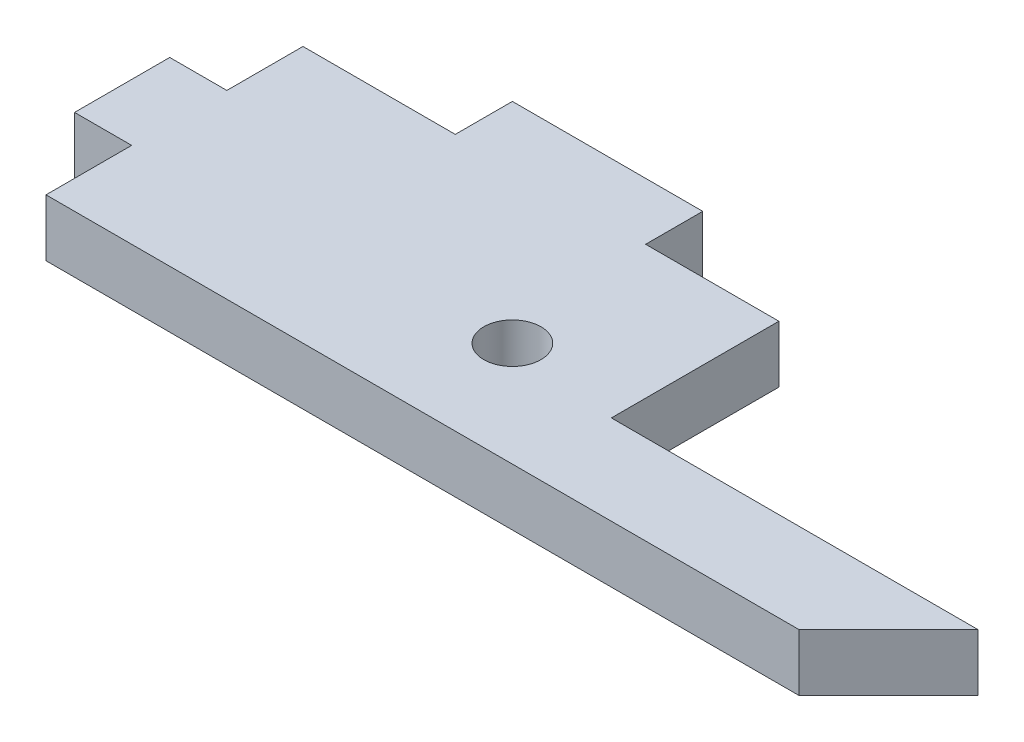
ISO-10303-21;
HEADER;
FILE_DESCRIPTION(('STEP AP214'),'2;1');
FILE_NAME('part.step','',(''),(''),'','','');
FILE_SCHEMA(('AUTOMOTIVE_DESIGN { 1 0 10303 214 1 1 1 1 }'));
ENDSEC;
DATA;
#1=APPLICATION_CONTEXT('core data for automotive mechanical design processes');
#2=APPLICATION_PROTOCOL_DEFINITION('international standard','automotive_design',2000,#1);
#3=PRODUCT_CONTEXT('',#1,'mechanical');
#4=PRODUCT('Part','Part','',(#3));
#5=PRODUCT_RELATED_PRODUCT_CATEGORY('part','',(#4));
#6=PRODUCT_DEFINITION_FORMATION('','',#4);
#7=PRODUCT_DEFINITION_CONTEXT('part definition',#1,'design');
#8=PRODUCT_DEFINITION('design','',#6,#7);
#9=PRODUCT_DEFINITION_SHAPE('','',#8);
#10=(LENGTH_UNIT() NAMED_UNIT(*) SI_UNIT(.MILLI.,.METRE.));
#11=(NAMED_UNIT(*) PLANE_ANGLE_UNIT() SI_UNIT($,.RADIAN.));
#12=(NAMED_UNIT(*) SI_UNIT($,.STERADIAN.) SOLID_ANGLE_UNIT());
#13=UNCERTAINTY_MEASURE_WITH_UNIT(LENGTH_MEASURE(1.E-05),#10,'distance_accuracy_value','');
#14=(GEOMETRIC_REPRESENTATION_CONTEXT(3) GLOBAL_UNCERTAINTY_ASSIGNED_CONTEXT((#13)) GLOBAL_UNIT_ASSIGNED_CONTEXT((#10,
#11,#12)) REPRESENTATION_CONTEXT('',''));
#15=CARTESIAN_POINT('',(0.,0.,0.));
#16=DIRECTION('',(0.,0.,1.));
#17=DIRECTION('',(1.,0.,0.));
#18=AXIS2_PLACEMENT_3D('',#15,#16,#17);
#19=CARTESIAN_POINT('',(0.,3.,0.));
#20=DIRECTION('',(0.,-1.,0.));
#21=DIRECTION('',(0.,0.,-1.));
#22=AXIS2_PLACEMENT_3D('',#19,#20,#21);
#23=PLANE('',#22);
#24=DIRECTION('',(0.,0.,1.));
#25=VECTOR('',#24,1.);
#26=CARTESIAN_POINT('',(-45.8890246544318,3.,12.6810465595323));
#27=LINE('',#26,#25);
#28=CARTESIAN_POINT('',(-45.8890246544318,3.,8.18104655953229));
#29=VERTEX_POINT('',#28);
#30=CARTESIAN_POINT('',(-45.8890246544318,3.,12.6810465595323));
#31=VERTEX_POINT('',#30);
#32=EDGE_CURVE('E193',#29,#31,#27,.T.);
#33=ORIENTED_EDGE('',*,*,#32,.T.);
#34=DIRECTION('',(1.,0.,0.));
#35=VECTOR('',#34,1.);
#36=CARTESIAN_POINT('',(-6.32902465443183,3.,12.6810465595323));
#37=LINE('',#36,#35);
#38=CARTESIAN_POINT('',(-6.32902465443183,3.,12.6810465595323));
#39=VERTEX_POINT('',#38);
#40=EDGE_CURVE('E111',#31,#39,#37,.T.);
#41=ORIENTED_EDGE('',*,*,#40,.T.);
#42=DIRECTION('',(0.707106781186546,0.,-0.707106781186549));
#43=VECTOR('',#42,1.);
#44=CARTESIAN_POINT('',(-1.62902465443185,3.,7.98104655953229));
#45=LINE('',#44,#43);
#46=CARTESIAN_POINT('',(-1.62902465443185,3.,7.98104655953229));
#47=VERTEX_POINT('',#46);
#48=EDGE_CURVE('E226',#39,#47,#45,.T.);
#49=ORIENTED_EDGE('',*,*,#48,.T.);
#50=DIRECTION('',(-1.,0.,0.));
#51=VECTOR('',#50,1.);
#52=CARTESIAN_POINT('',(-20.8890246544319,3.,7.98104655953229));
#53=LINE('',#52,#51);
#54=CARTESIAN_POINT('',(-20.8890246544319,3.,7.98104655953229));
#55=VERTEX_POINT('',#54);
#56=EDGE_CURVE('E245',#47,#55,#53,.T.);
#57=ORIENTED_EDGE('',*,*,#56,.T.);
#58=DIRECTION('',(0.,0.,-1.));
#59=VECTOR('',#58,1.);
#60=CARTESIAN_POINT('',(-20.8890246544319,3.,-0.818953440467708));
#61=LINE('',#60,#59);
#62=CARTESIAN_POINT('',(-20.8890246544319,3.,-0.818953440467708));
#63=VERTEX_POINT('',#62);
#64=EDGE_CURVE('E242',#55,#63,#61,.T.);
#65=ORIENTED_EDGE('',*,*,#64,.T.);
#66=DIRECTION('',(-1.,0.,0.));
#67=VECTOR('',#66,1.);
#68=CARTESIAN_POINT('',(-27.8890246544319,3.,-0.818953440467708));
#69=LINE('',#68,#67);
#70=CARTESIAN_POINT('',(-27.8890246544319,3.,-0.818953440467708));
#71=VERTEX_POINT('',#70);
#72=EDGE_CURVE('E244',#63,#71,#69,.T.);
#73=ORIENTED_EDGE('',*,*,#72,.T.);
#74=DIRECTION('',(0.,0.,-1.));
#75=VECTOR('',#74,1.);
#76=CARTESIAN_POINT('',(-27.8890246544318,3.,-3.81895344046771));
#77=LINE('',#76,#75);
#78=CARTESIAN_POINT('',(-27.8890246544318,3.,-3.81895344046771));
#79=VERTEX_POINT('',#78);
#80=EDGE_CURVE('E247',#71,#79,#77,.T.);
#81=ORIENTED_EDGE('',*,*,#80,.T.);
#82=DIRECTION('',(-1.,0.,0.));
#83=VECTOR('',#82,1.);
#84=CARTESIAN_POINT('',(-37.8890246544319,3.,-3.81895344046771));
#85=LINE('',#84,#83);
#86=CARTESIAN_POINT('',(-37.8890246544319,3.,-3.81895344046771));
#87=VERTEX_POINT('',#86);
#88=EDGE_CURVE('E253',#79,#87,#85,.T.);
#89=ORIENTED_EDGE('',*,*,#88,.T.);
#90=DIRECTION('',(0.,0.,1.));
#91=VECTOR('',#90,1.);
#92=CARTESIAN_POINT('',(-37.8890246544319,3.,-0.818953440467708));
#93=LINE('',#92,#91);
#94=CARTESIAN_POINT('',(-37.8890246544319,3.,-0.818953440467708));
#95=VERTEX_POINT('',#94);
#96=EDGE_CURVE('E255',#87,#95,#93,.T.);
#97=ORIENTED_EDGE('',*,*,#96,.T.);
#98=DIRECTION('',(-1.,0.,0.));
#99=VECTOR('',#98,1.);
#100=CARTESIAN_POINT('',(-45.8890246544319,3.,-0.818953440467708));
#101=LINE('',#100,#99);
#102=CARTESIAN_POINT('',(-45.8890246544319,3.,-0.818953440467708));
#103=VERTEX_POINT('',#102);
#104=EDGE_CURVE('E257',#95,#103,#101,.T.);
#105=ORIENTED_EDGE('',*,*,#104,.T.);
#106=DIRECTION('',(0.,0.,1.));
#107=VECTOR('',#106,1.);
#108=CARTESIAN_POINT('',(-45.8890246544319,3.,3.18104655953229));
#109=LINE('',#108,#107);
#110=CARTESIAN_POINT('',(-45.8890246544319,3.,3.18104655953229));
#111=VERTEX_POINT('',#110);
#112=EDGE_CURVE('E148',#103,#111,#109,.T.);
#113=ORIENTED_EDGE('',*,*,#112,.T.);
#114=DIRECTION('',(-1.,0.,0.));
#115=VECTOR('',#114,1.);
#116=CARTESIAN_POINT('',(-45.8890246544319,3.,3.18104655953229));
#117=LINE('',#116,#115);
#118=CARTESIAN_POINT('',(-48.8890246544318,3.,3.18104655953229));
#119=VERTEX_POINT('',#118);
#120=EDGE_CURVE('E142',#111,#119,#117,.T.);
#121=ORIENTED_EDGE('',*,*,#120,.T.);
#122=DIRECTION('',(0.,0.,1.));
#123=VECTOR('',#122,1.);
#124=CARTESIAN_POINT('',(-48.8890246544318,3.,3.18104655953229));
#125=LINE('',#124,#123);
#126=CARTESIAN_POINT('',(-48.8890246544318,3.,8.18104655953229));
#127=VERTEX_POINT('',#126);
#128=EDGE_CURVE('E146',#119,#127,#125,.T.);
#129=ORIENTED_EDGE('',*,*,#128,.T.);
#130=DIRECTION('',(1.,0.,0.));
#131=VECTOR('',#130,1.);
#132=CARTESIAN_POINT('',(-48.8890246544318,3.,8.18104655953229));
#133=LINE('',#132,#131);
#134=EDGE_CURVE('E50',#127,#29,#133,.T.);
#135=ORIENTED_EDGE('',*,*,#134,.T.);
#136=EDGE_LOOP('',(#33,#41,#49,#57,#65,#73,#81,#89,#97,#105,#113,#121,#129,#135));
#137=FACE_BOUND('',#136,.T.);
#138=CARTESIAN_POINT('',(-26.8890246544318,3.,7.18104655953229));
#139=DIRECTION('',(0.,1.,0.));
#140=DIRECTION('',(0.,0.,1.));
#141=AXIS2_PLACEMENT_3D('',#138,#139,#140);
#142=CIRCLE('',#141,1.5);
#143=CARTESIAN_POINT('',(-26.8890246544318,3.,8.68104655953229));
#144=VERTEX_POINT('',#143);
#145=EDGE_CURVE('E170',#144,#144,#142,.T.);
#146=ORIENTED_EDGE('',*,*,#145,.F.);
#147=EDGE_LOOP('',(#146));
#148=FACE_BOUND('',#147,.T.);
#149=ADVANCED_FACE('F33',(#137,#148),#23,.F.);
#150=CARTESIAN_POINT('',(0.,0.,0.));
#151=DIRECTION('',(0.,-1.,0.));
#152=DIRECTION('',(0.,0.,-1.));
#153=AXIS2_PLACEMENT_3D('',#150,#151,#152);
#154=PLANE('',#153);
#155=DIRECTION('',(0.,0.,1.));
#156=VECTOR('',#155,1.);
#157=CARTESIAN_POINT('',(-45.8890246544318,0.,12.6810465595323));
#158=LINE('',#157,#156);
#159=CARTESIAN_POINT('',(-45.8890246544318,0.,8.18104655953229));
#160=VERTEX_POINT('',#159);
#161=CARTESIAN_POINT('',(-45.8890246544318,0.,12.6810465595323));
#162=VERTEX_POINT('',#161);
#163=EDGE_CURVE('E166',#160,#162,#158,.T.);
#164=ORIENTED_EDGE('',*,*,#163,.F.);
#165=DIRECTION('',(1.,0.,0.));
#166=VECTOR('',#165,1.);
#167=CARTESIAN_POINT('',(-48.8890246544318,0.,8.18104655953229));
#168=LINE('',#167,#166);
#169=CARTESIAN_POINT('',(-48.8890246544318,0.,8.18104655953229));
#170=VERTEX_POINT('',#169);
#171=EDGE_CURVE('E103',#170,#160,#168,.T.);
#172=ORIENTED_EDGE('',*,*,#171,.F.);
#173=DIRECTION('',(0.,0.,1.));
#174=VECTOR('',#173,1.);
#175=CARTESIAN_POINT('',(-48.8890246544318,0.,3.18104655953229));
#176=LINE('',#175,#174);
#177=CARTESIAN_POINT('',(-48.8890246544318,0.,3.18104655953229));
#178=VERTEX_POINT('',#177);
#179=EDGE_CURVE('E97',#178,#170,#176,.T.);
#180=ORIENTED_EDGE('',*,*,#179,.F.);
#181=DIRECTION('',(-1.,0.,0.));
#182=VECTOR('',#181,1.);
#183=CARTESIAN_POINT('',(-45.8890246544319,0.,3.18104655953229));
#184=LINE('',#183,#182);
#185=CARTESIAN_POINT('',(-45.8890246544319,0.,3.18104655953229));
#186=VERTEX_POINT('',#185);
#187=EDGE_CURVE('E156',#186,#178,#184,.T.);
#188=ORIENTED_EDGE('',*,*,#187,.F.);
#189=DIRECTION('',(0.,0.,1.));
#190=VECTOR('',#189,1.);
#191=CARTESIAN_POINT('',(-45.8890246544319,0.,3.18104655953229));
#192=LINE('',#191,#190);
#193=CARTESIAN_POINT('',(-45.8890246544319,0.,-0.818953440467708));
#194=VERTEX_POINT('',#193);
#195=EDGE_CURVE('E188',#194,#186,#192,.T.);
#196=ORIENTED_EDGE('',*,*,#195,.F.);
#197=DIRECTION('',(-1.,0.,0.));
#198=VECTOR('',#197,1.);
#199=CARTESIAN_POINT('',(-45.8890246544319,0.,-0.818953440467708));
#200=LINE('',#199,#198);
#201=CARTESIAN_POINT('',(-37.8890246544319,0.,-0.818953440467708));
#202=VERTEX_POINT('',#201);
#203=EDGE_CURVE('E186',#202,#194,#200,.T.);
#204=ORIENTED_EDGE('',*,*,#203,.F.);
#205=DIRECTION('',(0.,0.,1.));
#206=VECTOR('',#205,1.);
#207=CARTESIAN_POINT('',(-37.8890246544319,0.,-0.818953440467708));
#208=LINE('',#207,#206);
#209=CARTESIAN_POINT('',(-37.8890246544319,0.,-3.81895344046771));
#210=VERTEX_POINT('',#209);
#211=EDGE_CURVE('E184',#210,#202,#208,.T.);
#212=ORIENTED_EDGE('',*,*,#211,.F.);
#213=DIRECTION('',(-1.,0.,0.));
#214=VECTOR('',#213,1.);
#215=CARTESIAN_POINT('',(-37.8890246544319,0.,-3.81895344046771));
#216=LINE('',#215,#214);
#217=CARTESIAN_POINT('',(-27.8890246544318,0.,-3.81895344046771));
#218=VERTEX_POINT('',#217);
#219=EDGE_CURVE('E182',#218,#210,#216,.T.);
#220=ORIENTED_EDGE('',*,*,#219,.F.);
#221=DIRECTION('',(0.,0.,-1.));
#222=VECTOR('',#221,1.);
#223=CARTESIAN_POINT('',(-27.8890246544318,0.,-3.81895344046771));
#224=LINE('',#223,#222);
#225=CARTESIAN_POINT('',(-27.8890246544319,0.,-0.818953440467708));
#226=VERTEX_POINT('',#225);
#227=EDGE_CURVE('E180',#226,#218,#224,.T.);
#228=ORIENTED_EDGE('',*,*,#227,.F.);
#229=DIRECTION('',(-1.,0.,0.));
#230=VECTOR('',#229,1.);
#231=CARTESIAN_POINT('',(-27.8890246544319,0.,-0.818953440467708));
#232=LINE('',#231,#230);
#233=CARTESIAN_POINT('',(-20.8890246544319,0.,-0.818953440467708));
#234=VERTEX_POINT('',#233);
#235=EDGE_CURVE('E178',#234,#226,#232,.T.);
#236=ORIENTED_EDGE('',*,*,#235,.F.);
#237=DIRECTION('',(0.,0.,-1.));
#238=VECTOR('',#237,1.);
#239=CARTESIAN_POINT('',(-20.8890246544319,0.,-0.818953440467708));
#240=LINE('',#239,#238);
#241=CARTESIAN_POINT('',(-20.8890246544319,0.,7.98104655953229));
#242=VERTEX_POINT('',#241);
#243=EDGE_CURVE('E176',#242,#234,#240,.T.);
#244=ORIENTED_EDGE('',*,*,#243,.F.);
#245=DIRECTION('',(-1.,0.,0.));
#246=VECTOR('',#245,1.);
#247=CARTESIAN_POINT('',(-20.8890246544319,0.,7.98104655953229));
#248=LINE('',#247,#246);
#249=CARTESIAN_POINT('',(-1.62902465443185,0.,7.98104655953229));
#250=VERTEX_POINT('',#249);
#251=EDGE_CURVE('E174',#250,#242,#248,.T.);
#252=ORIENTED_EDGE('',*,*,#251,.F.);
#253=DIRECTION('',(0.707106781186546,0.,-0.707106781186549));
#254=VECTOR('',#253,1.);
#255=CARTESIAN_POINT('',(-1.62902465443185,0.,7.98104655953229));
#256=LINE('',#255,#254);
#257=CARTESIAN_POINT('',(-6.32902465443183,0.,12.6810465595323));
#258=VERTEX_POINT('',#257);
#259=EDGE_CURVE('E172',#258,#250,#256,.T.);
#260=ORIENTED_EDGE('',*,*,#259,.F.);
#261=DIRECTION('',(1.,0.,0.));
#262=VECTOR('',#261,1.);
#263=CARTESIAN_POINT('',(-6.32902465443183,0.,12.6810465595323));
#264=LINE('',#263,#262);
#265=EDGE_CURVE('E169',#162,#258,#264,.T.);
#266=ORIENTED_EDGE('',*,*,#265,.F.);
#267=EDGE_LOOP('',(#164,#172,#180,#188,#196,#204,#212,#220,#228,#236,#244,#252,#260,#266));
#268=FACE_BOUND('',#267,.T.);
#269=CARTESIAN_POINT('',(-26.8890246544318,0.,7.18104655953229));
#270=DIRECTION('',(0.,1.,0.));
#271=DIRECTION('',(0.,0.,1.));
#272=AXIS2_PLACEMENT_3D('',#269,#270,#271);
#273=CIRCLE('',#272,1.5);
#274=CARTESIAN_POINT('',(-26.8890246544318,0.,8.68104655953229));
#275=VERTEX_POINT('',#274);
#276=EDGE_CURVE('E430',#275,#275,#273,.T.);
#277=ORIENTED_EDGE('',*,*,#276,.T.);
#278=EDGE_LOOP('',(#277));
#279=FACE_BOUND('',#278,.T.);
#280=ADVANCED_FACE('F230',(#268,#279),#154,.T.);
#281=CARTESIAN_POINT('',(-45.8890246544318,3.,12.6810465595323));
#282=DIRECTION('',(1.,0.,0.));
#283=DIRECTION('',(0.,0.,-1.));
#284=AXIS2_PLACEMENT_3D('',#281,#282,#283);
#285=PLANE('',#284);
#286=ORIENTED_EDGE('',*,*,#163,.T.);
#287=DIRECTION('',(0.,-1.,0.));
#288=VECTOR('',#287,1.);
#289=CARTESIAN_POINT('',(-45.8890246544318,3.,12.6810465595323));
#290=LINE('',#289,#288);
#291=EDGE_CURVE('E11',#31,#162,#290,.T.);
#292=ORIENTED_EDGE('',*,*,#291,.F.);
#293=ORIENTED_EDGE('',*,*,#32,.F.);
#294=DIRECTION('',(0.,-1.,0.));
#295=VECTOR('',#294,1.);
#296=CARTESIAN_POINT('',(-45.8890246544318,3.,8.18104655953229));
#297=LINE('',#296,#295);
#298=EDGE_CURVE('E162',#29,#160,#297,.T.);
#299=ORIENTED_EDGE('',*,*,#298,.T.);
#300=EDGE_LOOP('',(#286,#292,#293,#299));
#301=FACE_BOUND('',#300,.T.);
#302=ADVANCED_FACE('F35',(#301),#285,.F.);
#303=CARTESIAN_POINT('',(-6.32902465443183,3.,12.6810465595323));
#304=DIRECTION('',(0.,0.,-1.));
#305=DIRECTION('',(-1.,0.,0.));
#306=AXIS2_PLACEMENT_3D('',#303,#304,#305);
#307=PLANE('',#306);
#308=ORIENTED_EDGE('',*,*,#265,.T.);
#309=DIRECTION('',(0.,-1.,0.));
#310=VECTOR('',#309,1.);
#311=CARTESIAN_POINT('',(-6.32902465443183,3.,12.6810465595323));
#312=LINE('',#311,#310);
#313=EDGE_CURVE('E42',#39,#258,#312,.T.);
#314=ORIENTED_EDGE('',*,*,#313,.F.);
#315=ORIENTED_EDGE('',*,*,#40,.F.);
#316=ORIENTED_EDGE('',*,*,#291,.T.);
#317=EDGE_LOOP('',(#308,#314,#315,#316));
#318=FACE_BOUND('',#317,.T.);
#319=ADVANCED_FACE('F291',(#318),#307,.F.);
#320=CARTESIAN_POINT('',(-1.62902465443185,3.,7.98104655953229));
#321=DIRECTION('',(-0.707106781186549,0.,-0.707106781186546));
#322=DIRECTION('',(-0.707106781186546,0.,0.707106781186549));
#323=AXIS2_PLACEMENT_3D('',#320,#321,#322);
#324=PLANE('',#323);
#325=ORIENTED_EDGE('',*,*,#259,.T.);
#326=DIRECTION('',(0.,-1.,0.));
#327=VECTOR('',#326,1.);
#328=CARTESIAN_POINT('',(-1.62902465443185,3.,7.98104655953229));
#329=LINE('',#328,#327);
#330=EDGE_CURVE('E218',#47,#250,#329,.T.);
#331=ORIENTED_EDGE('',*,*,#330,.F.);
#332=ORIENTED_EDGE('',*,*,#48,.F.);
#333=ORIENTED_EDGE('',*,*,#313,.T.);
#334=EDGE_LOOP('',(#325,#331,#332,#333));
#335=FACE_BOUND('',#334,.T.);
#336=ADVANCED_FACE('F224',(#335),#324,.F.);
#337=CARTESIAN_POINT('',(-20.8890246544319,3.,7.98104655953229));
#338=DIRECTION('',(0.,0.,1.));
#339=DIRECTION('',(1.,0.,0.));
#340=AXIS2_PLACEMENT_3D('',#337,#338,#339);
#341=PLANE('',#340);
#342=ORIENTED_EDGE('',*,*,#251,.T.);
#343=DIRECTION('',(0.,-1.,0.));
#344=VECTOR('',#343,1.);
#345=CARTESIAN_POINT('',(-20.8890246544319,3.,7.98104655953229));
#346=LINE('',#345,#344);
#347=EDGE_CURVE('E215',#55,#242,#346,.T.);
#348=ORIENTED_EDGE('',*,*,#347,.F.);
#349=ORIENTED_EDGE('',*,*,#56,.F.);
#350=ORIENTED_EDGE('',*,*,#330,.T.);
#351=EDGE_LOOP('',(#342,#348,#349,#350));
#352=FACE_BOUND('',#351,.T.);
#353=ADVANCED_FACE('F236',(#352),#341,.F.);
#354=CARTESIAN_POINT('',(-20.8890246544319,3.,-0.818953440467708));
#355=DIRECTION('',(-1.,0.,0.));
#356=DIRECTION('',(0.,0.,1.));
#357=AXIS2_PLACEMENT_3D('',#354,#355,#356);
#358=PLANE('',#357);
#359=ORIENTED_EDGE('',*,*,#243,.T.);
#360=DIRECTION('',(0.,-1.,0.));
#361=VECTOR('',#360,1.);
#362=CARTESIAN_POINT('',(-20.8890246544319,3.,-0.818953440467708));
#363=LINE('',#362,#361);
#364=EDGE_CURVE('E212',#63,#234,#363,.T.);
#365=ORIENTED_EDGE('',*,*,#364,.F.);
#366=ORIENTED_EDGE('',*,*,#64,.F.);
#367=ORIENTED_EDGE('',*,*,#347,.T.);
#368=EDGE_LOOP('',(#359,#365,#366,#367));
#369=FACE_BOUND('',#368,.T.);
#370=ADVANCED_FACE('F240',(#369),#358,.F.);
#371=CARTESIAN_POINT('',(-27.8890246544319,3.,-0.818953440467708));
#372=DIRECTION('',(0.,0.,1.));
#373=DIRECTION('',(1.,0.,0.));
#374=AXIS2_PLACEMENT_3D('',#371,#372,#373);
#375=PLANE('',#374);
#376=ORIENTED_EDGE('',*,*,#235,.T.);
#377=DIRECTION('',(0.,-1.,0.));
#378=VECTOR('',#377,1.);
#379=CARTESIAN_POINT('',(-27.8890246544319,3.,-0.818953440467708));
#380=LINE('',#379,#378);
#381=EDGE_CURVE('E209',#71,#226,#380,.T.);
#382=ORIENTED_EDGE('',*,*,#381,.F.);
#383=ORIENTED_EDGE('',*,*,#72,.F.);
#384=ORIENTED_EDGE('',*,*,#364,.T.);
#385=EDGE_LOOP('',(#376,#382,#383,#384));
#386=FACE_BOUND('',#385,.T.);
#387=ADVANCED_FACE('F304',(#386),#375,.F.);
#388=CARTESIAN_POINT('',(-27.8890246544318,3.,-3.81895344046771));
#389=DIRECTION('',(-1.,0.,0.));
#390=DIRECTION('',(0.,0.,1.));
#391=AXIS2_PLACEMENT_3D('',#388,#389,#390);
#392=PLANE('',#391);
#393=ORIENTED_EDGE('',*,*,#227,.T.);
#394=DIRECTION('',(0.,-1.,0.));
#395=VECTOR('',#394,1.);
#396=CARTESIAN_POINT('',(-27.8890246544318,3.,-3.81895344046771));
#397=LINE('',#396,#395);
#398=EDGE_CURVE('E206',#79,#218,#397,.T.);
#399=ORIENTED_EDGE('',*,*,#398,.F.);
#400=ORIENTED_EDGE('',*,*,#80,.F.);
#401=ORIENTED_EDGE('',*,*,#381,.T.);
#402=EDGE_LOOP('',(#393,#399,#400,#401));
#403=FACE_BOUND('',#402,.T.);
#404=ADVANCED_FACE('F307',(#403),#392,.F.);
#405=CARTESIAN_POINT('',(-37.8890246544319,3.,-3.81895344046771));
#406=DIRECTION('',(0.,0.,1.));
#407=DIRECTION('',(1.,0.,0.));
#408=AXIS2_PLACEMENT_3D('',#405,#406,#407);
#409=PLANE('',#408);
#410=ORIENTED_EDGE('',*,*,#219,.T.);
#411=DIRECTION('',(0.,-1.,0.));
#412=VECTOR('',#411,1.);
#413=CARTESIAN_POINT('',(-37.8890246544319,3.,-3.81895344046771));
#414=LINE('',#413,#412);
#415=EDGE_CURVE('E203',#87,#210,#414,.T.);
#416=ORIENTED_EDGE('',*,*,#415,.F.);
#417=ORIENTED_EDGE('',*,*,#88,.F.);
#418=ORIENTED_EDGE('',*,*,#398,.T.);
#419=EDGE_LOOP('',(#410,#416,#417,#418));
#420=FACE_BOUND('',#419,.T.);
#421=ADVANCED_FACE('F311',(#420),#409,.F.);
#422=CARTESIAN_POINT('',(-37.8890246544319,3.,-0.818953440467708));
#423=DIRECTION('',(1.,0.,0.));
#424=DIRECTION('',(0.,0.,-1.));
#425=AXIS2_PLACEMENT_3D('',#422,#423,#424);
#426=PLANE('',#425);
#427=ORIENTED_EDGE('',*,*,#211,.T.);
#428=DIRECTION('',(0.,-1.,0.));
#429=VECTOR('',#428,1.);
#430=CARTESIAN_POINT('',(-37.8890246544319,3.,-0.818953440467708));
#431=LINE('',#430,#429);
#432=EDGE_CURVE('E200',#95,#202,#431,.T.);
#433=ORIENTED_EDGE('',*,*,#432,.F.);
#434=ORIENTED_EDGE('',*,*,#96,.F.);
#435=ORIENTED_EDGE('',*,*,#415,.T.);
#436=EDGE_LOOP('',(#427,#433,#434,#435));
#437=FACE_BOUND('',#436,.T.);
#438=ADVANCED_FACE('F315',(#437),#426,.F.);
#439=CARTESIAN_POINT('',(-45.8890246544319,3.,-0.818953440467708));
#440=DIRECTION('',(0.,0.,1.));
#441=DIRECTION('',(1.,0.,0.));
#442=AXIS2_PLACEMENT_3D('',#439,#440,#441);
#443=PLANE('',#442);
#444=ORIENTED_EDGE('',*,*,#203,.T.);
#445=DIRECTION('',(0.,-1.,0.));
#446=VECTOR('',#445,1.);
#447=CARTESIAN_POINT('',(-45.8890246544319,3.,-0.818953440467708));
#448=LINE('',#447,#446);
#449=EDGE_CURVE('E197',#103,#194,#448,.T.);
#450=ORIENTED_EDGE('',*,*,#449,.F.);
#451=ORIENTED_EDGE('',*,*,#104,.F.);
#452=ORIENTED_EDGE('',*,*,#432,.T.);
#453=EDGE_LOOP('',(#444,#450,#451,#452));
#454=FACE_BOUND('',#453,.T.);
#455=ADVANCED_FACE('F263',(#454),#443,.F.);
#456=CARTESIAN_POINT('',(-45.8890246544319,3.,3.18104655953229));
#457=DIRECTION('',(1.,0.,0.));
#458=DIRECTION('',(0.,0.,-1.));
#459=AXIS2_PLACEMENT_3D('',#456,#457,#458);
#460=PLANE('',#459);
#461=ORIENTED_EDGE('',*,*,#195,.T.);
#462=DIRECTION('',(0.,-1.,0.));
#463=VECTOR('',#462,1.);
#464=CARTESIAN_POINT('',(-45.8890246544319,3.,3.18104655953229));
#465=LINE('',#464,#463);
#466=EDGE_CURVE('E157',#111,#186,#465,.T.);
#467=ORIENTED_EDGE('',*,*,#466,.F.);
#468=ORIENTED_EDGE('',*,*,#112,.F.);
#469=ORIENTED_EDGE('',*,*,#449,.T.);
#470=EDGE_LOOP('',(#461,#467,#468,#469));
#471=FACE_BOUND('',#470,.T.);
#472=ADVANCED_FACE('F267',(#471),#460,.F.);
#473=CARTESIAN_POINT('',(-45.8890246544319,3.,3.18104655953229));
#474=DIRECTION('',(0.,0.,1.));
#475=DIRECTION('',(1.,0.,0.));
#476=AXIS2_PLACEMENT_3D('',#473,#474,#475);
#477=PLANE('',#476);
#478=ORIENTED_EDGE('',*,*,#187,.T.);
#479=DIRECTION('',(0.,-1.,0.));
#480=VECTOR('',#479,1.);
#481=CARTESIAN_POINT('',(-48.8890246544318,3.,3.18104655953229));
#482=LINE('',#481,#480);
#483=EDGE_CURVE('E153',#119,#178,#482,.T.);
#484=ORIENTED_EDGE('',*,*,#483,.F.);
#485=ORIENTED_EDGE('',*,*,#120,.F.);
#486=ORIENTED_EDGE('',*,*,#466,.T.);
#487=EDGE_LOOP('',(#478,#484,#485,#486));
#488=FACE_BOUND('',#487,.T.);
#489=ADVANCED_FACE('F154',(#488),#477,.F.);
#490=CARTESIAN_POINT('',(-48.8890246544318,3.,3.18104655953229));
#491=DIRECTION('',(1.,0.,0.));
#492=DIRECTION('',(0.,0.,-1.));
#493=AXIS2_PLACEMENT_3D('',#490,#491,#492);
#494=PLANE('',#493);
#495=ORIENTED_EDGE('',*,*,#179,.T.);
#496=DIRECTION('',(0.,-1.,0.));
#497=VECTOR('',#496,1.);
#498=CARTESIAN_POINT('',(-48.8890246544318,3.,8.18104655953229));
#499=LINE('',#498,#497);
#500=EDGE_CURVE('E158',#127,#170,#499,.T.);
#501=ORIENTED_EDGE('',*,*,#500,.F.);
#502=ORIENTED_EDGE('',*,*,#128,.F.);
#503=ORIENTED_EDGE('',*,*,#483,.T.);
#504=EDGE_LOOP('',(#495,#501,#502,#503));
#505=FACE_BOUND('',#504,.T.);
#506=ADVANCED_FACE('F160',(#505),#494,.F.);
#507=CARTESIAN_POINT('',(-48.8890246544318,3.,8.18104655953229));
#508=DIRECTION('',(0.,0.,-1.));
#509=DIRECTION('',(-1.,0.,0.));
#510=AXIS2_PLACEMENT_3D('',#507,#508,#509);
#511=PLANE('',#510);
#512=ORIENTED_EDGE('',*,*,#171,.T.);
#513=ORIENTED_EDGE('',*,*,#298,.F.);
#514=ORIENTED_EDGE('',*,*,#134,.F.);
#515=ORIENTED_EDGE('',*,*,#500,.T.);
#516=EDGE_LOOP('',(#512,#513,#514,#515));
#517=FACE_BOUND('',#516,.T.);
#518=ADVANCED_FACE('F271',(#517),#511,.F.);
#519=CARTESIAN_POINT('',(-26.8890246544318,3.,7.18104655953229));
#520=DIRECTION('',(0.,-1.,0.));
#521=DIRECTION('',(0.,0.,-1.));
#522=AXIS2_PLACEMENT_3D('',#519,#520,#521);
#523=CYLINDRICAL_SURFACE('',#522,1.5);
#524=ORIENTED_EDGE('',*,*,#145,.T.);
#525=EDGE_LOOP('',(#524));
#526=FACE_BOUND('',#525,.T.);
#527=ORIENTED_EDGE('',*,*,#276,.F.);
#528=EDGE_LOOP('',(#527));
#529=FACE_BOUND('',#528,.T.);
#530=ADVANCED_FACE('F273',(#526,#529),#523,.F.);
#531=CLOSED_SHELL('',(#149,#280,#302,#319,#336,#353,#370,#387,#404,#421,#438,#455,#472,#489,
#506,#518,#530));
#532=MANIFOLD_SOLID_BREP('B2',#531);
#533=ADVANCED_BREP_SHAPE_REPRESENTATION('',(#18,#532),#14);
#534=SHAPE_DEFINITION_REPRESENTATION(#9,#533);
ENDSEC;
END-ISO-10303-21;
